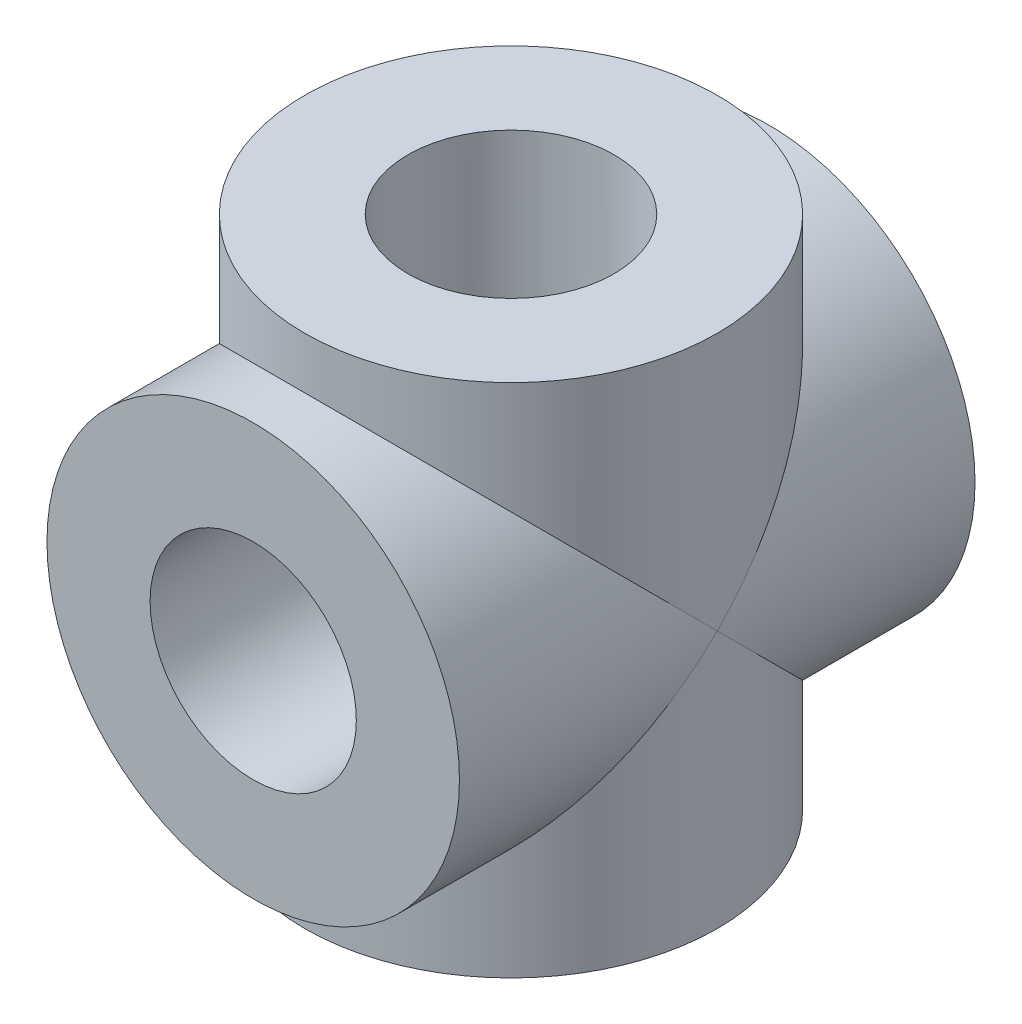
ISO-10303-21;
HEADER;
FILE_DESCRIPTION(('STEP AP214'),'2;1');
FILE_NAME('part.step','',(''),(''),'','','');
FILE_SCHEMA(('AUTOMOTIVE_DESIGN { 1 0 10303 214 1 1 1 1 }'));
ENDSEC;
DATA;
#1=APPLICATION_CONTEXT('core data for automotive mechanical design processes');
#2=APPLICATION_PROTOCOL_DEFINITION('international standard','automotive_design',2000,#1);
#3=PRODUCT_CONTEXT('',#1,'mechanical');
#4=PRODUCT('Part','Part','',(#3));
#5=PRODUCT_RELATED_PRODUCT_CATEGORY('part','',(#4));
#6=PRODUCT_DEFINITION_FORMATION('','',#4);
#7=PRODUCT_DEFINITION_CONTEXT('part definition',#1,'design');
#8=PRODUCT_DEFINITION('design','',#6,#7);
#9=PRODUCT_DEFINITION_SHAPE('','',#8);
#10=(LENGTH_UNIT() NAMED_UNIT(*) SI_UNIT(.MILLI.,.METRE.));
#11=(NAMED_UNIT(*) PLANE_ANGLE_UNIT() SI_UNIT($,.RADIAN.));
#12=(NAMED_UNIT(*) SI_UNIT($,.STERADIAN.) SOLID_ANGLE_UNIT());
#13=UNCERTAINTY_MEASURE_WITH_UNIT(LENGTH_MEASURE(1.E-05),#10,'distance_accuracy_value','');
#14=(GEOMETRIC_REPRESENTATION_CONTEXT(3) GLOBAL_UNCERTAINTY_ASSIGNED_CONTEXT((#13)) GLOBAL_UNIT_ASSIGNED_CONTEXT((#10,
#11,#12)) REPRESENTATION_CONTEXT('',''));
#15=CARTESIAN_POINT('',(0.,0.,0.));
#16=DIRECTION('',(0.,0.,1.));
#17=DIRECTION('',(1.,0.,0.));
#18=AXIS2_PLACEMENT_3D('',#15,#16,#17);
#19=CARTESIAN_POINT('',(0.,0.,5.));
#20=DIRECTION('',(0.,0.,-1.));
#21=DIRECTION('',(-1.,0.,0.));
#22=AXIS2_PLACEMENT_3D('',#19,#20,#21);
#23=CYLINDRICAL_SURFACE('',#22,2.);
#24=CARTESIAN_POINT('',(0.,0.,0.));
#25=DIRECTION('',(0.,0.707106781186547,-0.707106781186547));
#26=DIRECTION('',(0.,-0.707106781186547,-0.707106781186547));
#27=AXIS2_PLACEMENT_3D('',#24,#25,#26);
#28=ELLIPSE('',#27,2.82842712474619,2.);
#29=CARTESIAN_POINT('',(2.,0.,0.));
#30=VERTEX_POINT('',#29);
#31=CARTESIAN_POINT('',(-2.,0.,0.));
#32=VERTEX_POINT('',#31);
#33=EDGE_CURVE('E11',#30,#32,#28,.F.);
#34=ORIENTED_EDGE('',*,*,#33,.F.);
#35=CARTESIAN_POINT('',(0.,0.,0.));
#36=DIRECTION('',(0.,-0.707106781186547,-0.707106781186547));
#37=DIRECTION('',(0.,0.707106781186547,-0.707106781186547));
#38=AXIS2_PLACEMENT_3D('',#35,#36,#37);
#39=ELLIPSE('',#38,2.82842712474619,2.);
#40=EDGE_CURVE('E47',#32,#30,#39,.F.);
#41=ORIENTED_EDGE('',*,*,#40,.F.);
#42=EDGE_LOOP('',(#34,#41));
#43=FACE_BOUND('',#42,.T.);
#44=CARTESIAN_POINT('',(0.,0.,5.));
#45=DIRECTION('',(0.,0.,1.));
#46=DIRECTION('',(1.,0.,0.));
#47=AXIS2_PLACEMENT_3D('',#44,#45,#46);
#48=CIRCLE('',#47,2.);
#49=CARTESIAN_POINT('',(2.,0.,5.));
#50=VERTEX_POINT('',#49);
#51=EDGE_CURVE('E79',#50,#50,#48,.T.);
#52=ORIENTED_EDGE('',*,*,#51,.T.);
#53=EDGE_LOOP('',(#52));
#54=FACE_BOUND('',#53,.T.);
#55=ADVANCED_FACE('F33',(#43,#54),#23,.F.);
#56=CARTESIAN_POINT('',(0.,0.,5.));
#57=DIRECTION('',(0.,0.,-1.));
#58=DIRECTION('',(-1.,0.,0.));
#59=AXIS2_PLACEMENT_3D('',#56,#57,#58);
#60=CYLINDRICAL_SURFACE('',#59,4.);
#61=CARTESIAN_POINT('',(0.,0.,5.));
#62=DIRECTION('',(0.,0.,1.));
#63=DIRECTION('',(1.,0.,0.));
#64=AXIS2_PLACEMENT_3D('',#61,#62,#63);
#65=CIRCLE('',#64,4.);
#66=CARTESIAN_POINT('',(4.,0.,5.));
#67=VERTEX_POINT('',#66);
#68=EDGE_CURVE('E70',#67,#67,#65,.T.);
#69=ORIENTED_EDGE('',*,*,#68,.F.);
#70=EDGE_LOOP('',(#69));
#71=FACE_BOUND('',#70,.T.);
#72=CARTESIAN_POINT('',(0.,0.,0.));
#73=DIRECTION('',(0.,-0.707106781186547,-0.707106781186547));
#74=DIRECTION('',(0.,0.707106781186547,-0.707106781186547));
#75=AXIS2_PLACEMENT_3D('',#72,#73,#74);
#76=ELLIPSE('',#75,5.65685424949238,4.);
#77=CARTESIAN_POINT('',(4.,0.,0.));
#78=VERTEX_POINT('',#77);
#79=CARTESIAN_POINT('',(-4.,0.,0.));
#80=VERTEX_POINT('',#79);
#81=EDGE_CURVE('E90',#78,#80,#76,.T.);
#82=ORIENTED_EDGE('',*,*,#81,.F.);
#83=CARTESIAN_POINT('',(0.,0.,0.));
#84=DIRECTION('',(0.,0.707106781186547,-0.707106781186547));
#85=DIRECTION('',(0.,-0.707106781186547,-0.707106781186547));
#86=AXIS2_PLACEMENT_3D('',#83,#84,#85);
#87=ELLIPSE('',#86,5.65685424949238,4.);
#88=EDGE_CURVE('E92',#80,#78,#87,.T.);
#89=ORIENTED_EDGE('',*,*,#88,.F.);
#90=EDGE_LOOP('',(#82,#89));
#91=FACE_BOUND('',#90,.T.);
#92=ADVANCED_FACE('F120',(#71,#91),#60,.T.);
#93=CARTESIAN_POINT('',(0.,0.,5.));
#94=DIRECTION('',(0.,0.,1.));
#95=DIRECTION('',(1.,0.,0.));
#96=AXIS2_PLACEMENT_3D('',#93,#94,#95);
#97=PLANE('',#96);
#98=ORIENTED_EDGE('',*,*,#68,.T.);
#99=EDGE_LOOP('',(#98));
#100=FACE_BOUND('',#99,.T.);
#101=ORIENTED_EDGE('',*,*,#51,.F.);
#102=EDGE_LOOP('',(#101));
#103=FACE_BOUND('',#102,.T.);
#104=ADVANCED_FACE('F129',(#100,#103),#97,.T.);
#105=CARTESIAN_POINT('',(0.,5.,0.));
#106=DIRECTION('',(0.,-1.,0.));
#107=DIRECTION('',(0.,0.,-1.));
#108=AXIS2_PLACEMENT_3D('',#105,#106,#107);
#109=CYLINDRICAL_SURFACE('',#108,4.);
#110=CARTESIAN_POINT('',(0.,-5.,0.));
#111=DIRECTION('',(0.,1.,0.));
#112=DIRECTION('',(0.,0.,1.));
#113=AXIS2_PLACEMENT_3D('',#110,#111,#112);
#114=CIRCLE('',#113,4.);
#115=CARTESIAN_POINT('',(0.,-5.,4.));
#116=VERTEX_POINT('',#115);
#117=EDGE_CURVE('E97',#116,#116,#114,.T.);
#118=ORIENTED_EDGE('',*,*,#117,.T.);
#119=EDGE_LOOP('',(#118));
#120=FACE_BOUND('',#119,.T.);
#121=CARTESIAN_POINT('',(0.,0.,0.));
#122=DIRECTION('',(0.,0.707106781186547,-0.707106781186547));
#123=DIRECTION('',(0.,-0.707106781186547,-0.707106781186547));
#124=AXIS2_PLACEMENT_3D('',#121,#122,#123);
#125=ELLIPSE('',#124,5.65685424949238,4.);
#126=EDGE_CURVE('E54',#80,#78,#125,.F.);
#127=ORIENTED_EDGE('',*,*,#126,.T.);
#128=ORIENTED_EDGE('',*,*,#81,.T.);
#129=EDGE_LOOP('',(#127,#128));
#130=FACE_BOUND('',#129,.T.);
#131=ADVANCED_FACE('F143',(#120,#130),#109,.T.);
#132=CARTESIAN_POINT('',(0.,-5.,0.));
#133=DIRECTION('',(0.,1.,0.));
#134=DIRECTION('',(0.,0.,1.));
#135=AXIS2_PLACEMENT_3D('',#132,#133,#134);
#136=PLANE('',#135);
#137=ORIENTED_EDGE('',*,*,#117,.F.);
#138=EDGE_LOOP('',(#137));
#139=FACE_BOUND('',#138,.T.);
#140=CARTESIAN_POINT('',(0.,-5.,0.));
#141=DIRECTION('',(0.,1.,0.));
#142=DIRECTION('',(0.,0.,1.));
#143=AXIS2_PLACEMENT_3D('',#140,#141,#142);
#144=CIRCLE('',#143,2.);
#145=CARTESIAN_POINT('',(0.,-5.,2.));
#146=VERTEX_POINT('',#145);
#147=EDGE_CURVE('E103',#146,#146,#144,.T.);
#148=ORIENTED_EDGE('',*,*,#147,.T.);
#149=EDGE_LOOP('',(#148));
#150=FACE_BOUND('',#149,.T.);
#151=ADVANCED_FACE('F148',(#139,#150),#136,.F.);
#152=CARTESIAN_POINT('',(0.,5.,0.));
#153=DIRECTION('',(0.,-1.,0.));
#154=DIRECTION('',(0.,0.,-1.));
#155=AXIS2_PLACEMENT_3D('',#152,#153,#154);
#156=CYLINDRICAL_SURFACE('',#155,2.);
#157=ORIENTED_EDGE('',*,*,#147,.F.);
#158=EDGE_LOOP('',(#157));
#159=FACE_BOUND('',#158,.T.);
#160=CARTESIAN_POINT('',(0.,0.,0.));
#161=DIRECTION('',(0.,0.707106781186547,-0.707106781186547));
#162=DIRECTION('',(0.,-0.707106781186547,-0.707106781186547));
#163=AXIS2_PLACEMENT_3D('',#160,#161,#162);
#164=ELLIPSE('',#163,2.82842712474619,2.);
#165=EDGE_CURVE('E41',#30,#32,#164,.T.);
#166=ORIENTED_EDGE('',*,*,#165,.T.);
#167=ORIENTED_EDGE('',*,*,#40,.T.);
#168=EDGE_LOOP('',(#166,#167));
#169=FACE_BOUND('',#168,.T.);
#170=ADVANCED_FACE('F69',(#159,#169),#156,.F.);
#171=CARTESIAN_POINT('',(0.,5.,0.));
#172=DIRECTION('',(0.,1.,0.));
#173=DIRECTION('',(0.,0.,1.));
#174=AXIS2_PLACEMENT_3D('',#171,#172,#173);
#175=CIRCLE('',#174,4.);
#176=CARTESIAN_POINT('',(0.,5.,4.));
#177=VERTEX_POINT('',#176);
#178=EDGE_CURVE('E96',#177,#177,#175,.T.);
#179=ORIENTED_EDGE('',*,*,#178,.F.);
#180=EDGE_LOOP('',(#179));
#181=FACE_BOUND('',#180,.T.);
#182=ORIENTED_EDGE('',*,*,#88,.T.);
#183=CARTESIAN_POINT('',(0.,0.,0.));
#184=DIRECTION('',(0.,-0.707106781186547,-0.707106781186547));
#185=DIRECTION('',(0.,0.707106781186547,-0.707106781186547));
#186=AXIS2_PLACEMENT_3D('',#183,#184,#185);
#187=ELLIPSE('',#186,5.65685424949238,4.);
#188=EDGE_CURVE('E85',#78,#80,#187,.F.);
#189=ORIENTED_EDGE('',*,*,#188,.T.);
#190=EDGE_LOOP('',(#182,#189));
#191=FACE_BOUND('',#190,.T.);
#192=ADVANCED_FACE('F121',(#181,#191),#109,.T.);
#193=CARTESIAN_POINT('',(0.,5.,0.));
#194=DIRECTION('',(0.,1.,0.));
#195=DIRECTION('',(0.,0.,1.));
#196=AXIS2_PLACEMENT_3D('',#193,#194,#195);
#197=CIRCLE('',#196,2.);
#198=CARTESIAN_POINT('',(0.,5.,2.));
#199=VERTEX_POINT('',#198);
#200=EDGE_CURVE('E100',#199,#199,#197,.T.);
#201=ORIENTED_EDGE('',*,*,#200,.T.);
#202=EDGE_LOOP('',(#201));
#203=FACE_BOUND('',#202,.T.);
#204=ORIENTED_EDGE('',*,*,#33,.T.);
#205=CARTESIAN_POINT('',(0.,0.,0.));
#206=DIRECTION('',(0.,-0.707106781186547,-0.707106781186547));
#207=DIRECTION('',(0.,0.707106781186547,-0.707106781186547));
#208=AXIS2_PLACEMENT_3D('',#205,#206,#207);
#209=ELLIPSE('',#208,2.82842712474619,2.);
#210=EDGE_CURVE('E63',#32,#30,#209,.T.);
#211=ORIENTED_EDGE('',*,*,#210,.T.);
#212=EDGE_LOOP('',(#204,#211));
#213=FACE_BOUND('',#212,.T.);
#214=ADVANCED_FACE('F64',(#203,#213),#156,.F.);
#215=CARTESIAN_POINT('',(0.,5.,0.));
#216=DIRECTION('',(0.,1.,0.));
#217=DIRECTION('',(0.,0.,1.));
#218=AXIS2_PLACEMENT_3D('',#215,#216,#217);
#219=PLANE('',#218);
#220=ORIENTED_EDGE('',*,*,#178,.T.);
#221=EDGE_LOOP('',(#220));
#222=FACE_BOUND('',#221,.T.);
#223=ORIENTED_EDGE('',*,*,#200,.F.);
#224=EDGE_LOOP('',(#223));
#225=FACE_BOUND('',#224,.T.);
#226=ADVANCED_FACE('F110',(#222,#225),#219,.T.);
#227=CARTESIAN_POINT('',(0.,0.,-5.));
#228=DIRECTION('',(0.,0.,1.));
#229=DIRECTION('',(1.,0.,0.));
#230=AXIS2_PLACEMENT_3D('',#227,#228,#229);
#231=CIRCLE('',#230,4.);
#232=CARTESIAN_POINT('',(4.,0.,-5.));
#233=VERTEX_POINT('',#232);
#234=EDGE_CURVE('E76',#233,#233,#231,.T.);
#235=ORIENTED_EDGE('',*,*,#234,.T.);
#236=EDGE_LOOP('',(#235));
#237=FACE_BOUND('',#236,.T.);
#238=ORIENTED_EDGE('',*,*,#188,.F.);
#239=ORIENTED_EDGE('',*,*,#126,.F.);
#240=EDGE_LOOP('',(#238,#239));
#241=FACE_BOUND('',#240,.T.);
#242=ADVANCED_FACE('F35',(#237,#241),#60,.T.);
#243=CARTESIAN_POINT('',(0.,0.,-5.));
#244=DIRECTION('',(0.,0.,1.));
#245=DIRECTION('',(1.,0.,0.));
#246=AXIS2_PLACEMENT_3D('',#243,#244,#245);
#247=PLANE('',#246);
#248=ORIENTED_EDGE('',*,*,#234,.F.);
#249=EDGE_LOOP('',(#248));
#250=FACE_BOUND('',#249,.T.);
#251=CARTESIAN_POINT('',(0.,0.,-5.));
#252=DIRECTION('',(0.,0.,1.));
#253=DIRECTION('',(1.,0.,0.));
#254=AXIS2_PLACEMENT_3D('',#251,#252,#253);
#255=CIRCLE('',#254,2.);
#256=CARTESIAN_POINT('',(2.,0.,-5.));
#257=VERTEX_POINT('',#256);
#258=EDGE_CURVE('E82',#257,#257,#255,.T.);
#259=ORIENTED_EDGE('',*,*,#258,.T.);
#260=EDGE_LOOP('',(#259));
#261=FACE_BOUND('',#260,.T.);
#262=ADVANCED_FACE('F118',(#250,#261),#247,.F.);
#263=ORIENTED_EDGE('',*,*,#165,.F.);
#264=ORIENTED_EDGE('',*,*,#210,.F.);
#265=EDGE_LOOP('',(#263,#264));
#266=FACE_BOUND('',#265,.T.);
#267=ORIENTED_EDGE('',*,*,#258,.F.);
#268=EDGE_LOOP('',(#267));
#269=FACE_BOUND('',#268,.T.);
#270=ADVANCED_FACE('F73',(#266,#269),#23,.F.);
#271=CLOSED_SHELL('',(#55,#92,#104,#131,#151,#170,#192,#214,#226,#242,#262,#270));
#272=MANIFOLD_SOLID_BREP('B2',#271);
#273=ADVANCED_BREP_SHAPE_REPRESENTATION('',(#18,#272),#14);
#274=SHAPE_DEFINITION_REPRESENTATION(#9,#273);
ENDSEC;
END-ISO-10303-21;
